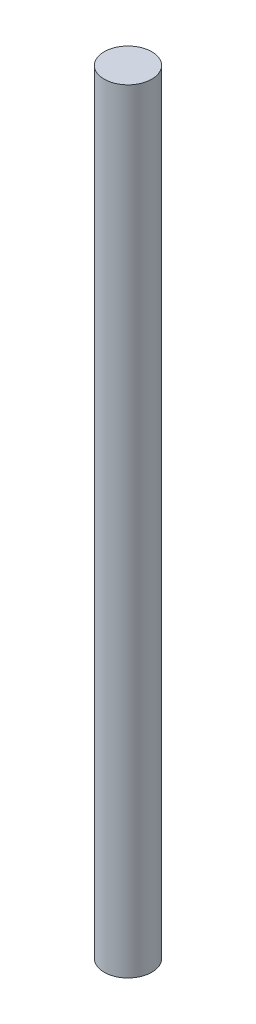
ISO-10303-21;
HEADER;
FILE_DESCRIPTION(('STEP AP214'),'2;1');
FILE_NAME('part.step','',(''),(''),'','','');
FILE_SCHEMA(('AUTOMOTIVE_DESIGN { 1 0 10303 214 1 1 1 1 }'));
ENDSEC;
DATA;
#1=APPLICATION_CONTEXT('core data for automotive mechanical design processes');
#2=APPLICATION_PROTOCOL_DEFINITION('international standard','automotive_design',2000,#1);
#3=PRODUCT_CONTEXT('',#1,'mechanical');
#4=PRODUCT('Part','Part','',(#3));
#5=PRODUCT_RELATED_PRODUCT_CATEGORY('part','',(#4));
#6=PRODUCT_DEFINITION_FORMATION('','',#4);
#7=PRODUCT_DEFINITION_CONTEXT('part definition',#1,'design');
#8=PRODUCT_DEFINITION('design','',#6,#7);
#9=PRODUCT_DEFINITION_SHAPE('','',#8);
#10=(LENGTH_UNIT() NAMED_UNIT(*) SI_UNIT(.MILLI.,.METRE.));
#11=(NAMED_UNIT(*) PLANE_ANGLE_UNIT() SI_UNIT($,.RADIAN.));
#12=(NAMED_UNIT(*) SI_UNIT($,.STERADIAN.) SOLID_ANGLE_UNIT());
#13=UNCERTAINTY_MEASURE_WITH_UNIT(LENGTH_MEASURE(1.E-05),#10,'distance_accuracy_value','');
#14=(GEOMETRIC_REPRESENTATION_CONTEXT(3) GLOBAL_UNCERTAINTY_ASSIGNED_CONTEXT((#13)) GLOBAL_UNIT_ASSIGNED_CONTEXT((#10,
#11,#12)) REPRESENTATION_CONTEXT('',''));
#15=CARTESIAN_POINT('',(0.,0.,0.));
#16=DIRECTION('',(0.,0.,1.));
#17=DIRECTION('',(1.,0.,0.));
#18=AXIS2_PLACEMENT_3D('',#15,#16,#17);
#19=CARTESIAN_POINT('',(0.,130.,0.));
#20=DIRECTION('',(0.,-1.,0.));
#21=DIRECTION('',(0.,0.,-1.));
#22=AXIS2_PLACEMENT_3D('',#19,#20,#21);
#23=CYLINDRICAL_SURFACE('',#22,4.);
#24=CARTESIAN_POINT('',(0.,130.,0.));
#25=DIRECTION('',(0.,1.,0.));
#26=DIRECTION('',(0.,0.,1.));
#27=AXIS2_PLACEMENT_3D('',#24,#25,#26);
#28=CIRCLE('',#27,4.);
#29=CARTESIAN_POINT('',(0.,130.,4.));
#30=VERTEX_POINT('',#29);
#31=EDGE_CURVE('E10',#30,#30,#28,.T.);
#32=ORIENTED_EDGE('',*,*,#31,.F.);
#33=EDGE_LOOP('',(#32));
#34=FACE_BOUND('',#33,.T.);
#35=CARTESIAN_POINT('',(0.,0.,0.));
#36=DIRECTION('',(0.,1.,0.));
#37=DIRECTION('',(0.,0.,1.));
#38=AXIS2_PLACEMENT_3D('',#35,#36,#37);
#39=CIRCLE('',#38,4.);
#40=CARTESIAN_POINT('',(0.,0.,4.));
#41=VERTEX_POINT('',#40);
#42=EDGE_CURVE('E34',#41,#41,#39,.T.);
#43=ORIENTED_EDGE('',*,*,#42,.T.);
#44=EDGE_LOOP('',(#43));
#45=FACE_BOUND('',#44,.T.);
#46=ADVANCED_FACE('F31',(#34,#45),#23,.T.);
#47=CARTESIAN_POINT('',(0.,130.,0.));
#48=DIRECTION('',(0.,1.,0.));
#49=DIRECTION('',(0.,0.,1.));
#50=AXIS2_PLACEMENT_3D('',#47,#48,#49);
#51=PLANE('',#50);
#52=ORIENTED_EDGE('',*,*,#31,.T.);
#53=EDGE_LOOP('',(#52));
#54=FACE_BOUND('',#53,.T.);
#55=ADVANCED_FACE('F46',(#54),#51,.T.);
#56=CARTESIAN_POINT('',(0.,0.,0.));
#57=DIRECTION('',(0.,1.,0.));
#58=DIRECTION('',(0.,0.,1.));
#59=AXIS2_PLACEMENT_3D('',#56,#57,#58);
#60=PLANE('',#59);
#61=ORIENTED_EDGE('',*,*,#42,.F.);
#62=EDGE_LOOP('',(#61));
#63=FACE_BOUND('',#62,.T.);
#64=ADVANCED_FACE('F44',(#63),#60,.F.);
#65=CLOSED_SHELL('',(#46,#55,#64));
#66=MANIFOLD_SOLID_BREP('B2',#65);
#67=ADVANCED_BREP_SHAPE_REPRESENTATION('',(#18,#66),#14);
#68=SHAPE_DEFINITION_REPRESENTATION(#9,#67);
ENDSEC;
END-ISO-10303-21;
